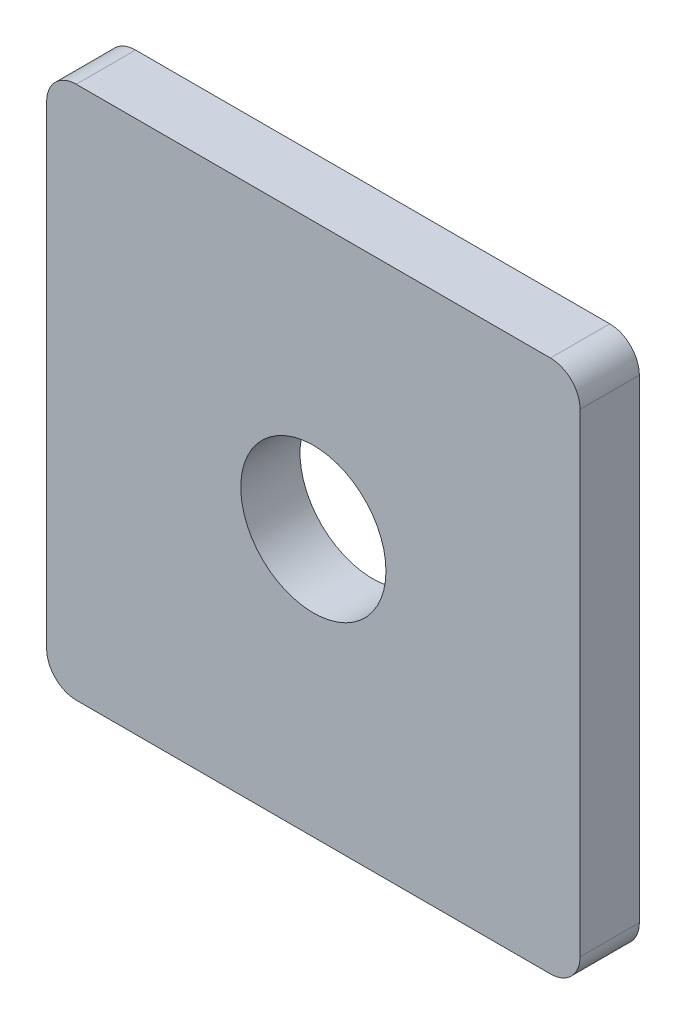
ISO-10303-21;
HEADER;
FILE_DESCRIPTION(('STEP AP214'),'2;1');
FILE_NAME('part.step','',(''),(''),'','','');
FILE_SCHEMA(('AUTOMOTIVE_DESIGN { 1 0 10303 214 1 1 1 1 }'));
ENDSEC;
DATA;
#1=APPLICATION_CONTEXT('core data for automotive mechanical design processes');
#2=APPLICATION_PROTOCOL_DEFINITION('international standard','automotive_design',2000,#1);
#3=PRODUCT_CONTEXT('',#1,'mechanical');
#4=PRODUCT('Part','Part','',(#3));
#5=PRODUCT_RELATED_PRODUCT_CATEGORY('part','',(#4));
#6=PRODUCT_DEFINITION_FORMATION('','',#4);
#7=PRODUCT_DEFINITION_CONTEXT('part definition',#1,'design');
#8=PRODUCT_DEFINITION('design','',#6,#7);
#9=PRODUCT_DEFINITION_SHAPE('','',#8);
#10=(LENGTH_UNIT() NAMED_UNIT(*) SI_UNIT(.MILLI.,.METRE.));
#11=(NAMED_UNIT(*) PLANE_ANGLE_UNIT() SI_UNIT($,.RADIAN.));
#12=(NAMED_UNIT(*) SI_UNIT($,.STERADIAN.) SOLID_ANGLE_UNIT());
#13=UNCERTAINTY_MEASURE_WITH_UNIT(LENGTH_MEASURE(1.E-05),#10,'distance_accuracy_value','');
#14=(GEOMETRIC_REPRESENTATION_CONTEXT(3) GLOBAL_UNCERTAINTY_ASSIGNED_CONTEXT((#13)) GLOBAL_UNIT_ASSIGNED_CONTEXT((#10,
#11,#12)) REPRESENTATION_CONTEXT('',''));
#15=CARTESIAN_POINT('',(0.,0.,0.));
#16=DIRECTION('',(0.,0.,1.));
#17=DIRECTION('',(1.,0.,0.));
#18=AXIS2_PLACEMENT_3D('',#15,#16,#17);
#19=CARTESIAN_POINT('',(0.,0.,2.));
#20=DIRECTION('',(0.,0.,1.));
#21=DIRECTION('',(1.,0.,0.));
#22=AXIS2_PLACEMENT_3D('',#19,#20,#21);
#23=PLANE('',#22);
#24=DIRECTION('',(0.,-1.,0.));
#25=VECTOR('',#24,1.);
#26=CARTESIAN_POINT('',(-9.,9.,2.));
#27=LINE('',#26,#25);
#28=CARTESIAN_POINT('',(-9.,8.,2.));
#29=VERTEX_POINT('',#28);
#30=CARTESIAN_POINT('',(-9.,-8.,2.));
#31=VERTEX_POINT('',#30);
#32=EDGE_CURVE('E171',#29,#31,#27,.T.);
#33=ORIENTED_EDGE('',*,*,#32,.T.);
#34=CARTESIAN_POINT('',(-8.,-8.,2.));
#35=DIRECTION('',(0.,0.,1.));
#36=DIRECTION('',(1.,0.,0.));
#37=AXIS2_PLACEMENT_3D('',#34,#35,#36);
#38=CIRCLE('',#37,1.);
#39=CARTESIAN_POINT('',(-8.,-9.,2.));
#40=VERTEX_POINT('',#39);
#41=EDGE_CURVE('E148',#31,#40,#38,.T.);
#42=ORIENTED_EDGE('',*,*,#41,.T.);
#43=DIRECTION('',(1.,0.,0.));
#44=VECTOR('',#43,1.);
#45=CARTESIAN_POINT('',(-9.,-9.,2.));
#46=LINE('',#45,#44);
#47=CARTESIAN_POINT('',(8.,-9.,2.));
#48=VERTEX_POINT('',#47);
#49=EDGE_CURVE('E119',#40,#48,#46,.T.);
#50=ORIENTED_EDGE('',*,*,#49,.T.);
#51=CARTESIAN_POINT('',(8.,-8.,2.));
#52=DIRECTION('',(0.,0.,1.));
#53=DIRECTION('',(1.,0.,0.));
#54=AXIS2_PLACEMENT_3D('',#51,#52,#53);
#55=CIRCLE('',#54,1.);
#56=CARTESIAN_POINT('',(9.,-8.,2.));
#57=VERTEX_POINT('',#56);
#58=EDGE_CURVE('E144',#48,#57,#55,.T.);
#59=ORIENTED_EDGE('',*,*,#58,.T.);
#60=DIRECTION('',(0.,1.,0.));
#61=VECTOR('',#60,1.);
#62=CARTESIAN_POINT('',(9.,9.,2.));
#63=LINE('',#62,#61);
#64=CARTESIAN_POINT('',(9.,8.,2.));
#65=VERTEX_POINT('',#64);
#66=EDGE_CURVE('E127',#57,#65,#63,.T.);
#67=ORIENTED_EDGE('',*,*,#66,.T.);
#68=CARTESIAN_POINT('',(8.,8.,2.));
#69=DIRECTION('',(0.,0.,1.));
#70=DIRECTION('',(1.,0.,0.));
#71=AXIS2_PLACEMENT_3D('',#68,#69,#70);
#72=CIRCLE('',#71,1.);
#73=CARTESIAN_POINT('',(8.,9.,2.));
#74=VERTEX_POINT('',#73);
#75=EDGE_CURVE('E54',#65,#74,#72,.T.);
#76=ORIENTED_EDGE('',*,*,#75,.T.);
#77=DIRECTION('',(-1.,0.,0.));
#78=VECTOR('',#77,1.);
#79=CARTESIAN_POINT('',(-9.,9.,2.));
#80=LINE('',#79,#78);
#81=CARTESIAN_POINT('',(-8.,9.,2.));
#82=VERTEX_POINT('',#81);
#83=EDGE_CURVE('E130',#74,#82,#80,.T.);
#84=ORIENTED_EDGE('',*,*,#83,.T.);
#85=CARTESIAN_POINT('',(-8.,8.,2.));
#86=DIRECTION('',(0.,0.,1.));
#87=DIRECTION('',(1.,0.,0.));
#88=AXIS2_PLACEMENT_3D('',#85,#86,#87);
#89=CIRCLE('',#88,1.);
#90=EDGE_CURVE('E146',#82,#29,#89,.T.);
#91=ORIENTED_EDGE('',*,*,#90,.T.);
#92=EDGE_LOOP('',(#33,#42,#50,#59,#67,#76,#84,#91));
#93=FACE_BOUND('',#92,.T.);
#94=CARTESIAN_POINT('',(0.,0.,2.));
#95=DIRECTION('',(0.,0.,1.));
#96=DIRECTION('',(1.,0.,0.));
#97=AXIS2_PLACEMENT_3D('',#94,#95,#96);
#98=CIRCLE('',#97,2.45);
#99=CARTESIAN_POINT('',(2.45,0.,2.));
#100=VERTEX_POINT('',#99);
#101=EDGE_CURVE('E167',#100,#100,#98,.T.);
#102=ORIENTED_EDGE('',*,*,#101,.F.);
#103=EDGE_LOOP('',(#102));
#104=FACE_BOUND('',#103,.T.);
#105=ADVANCED_FACE('F32',(#93,#104),#23,.T.);
#106=CARTESIAN_POINT('',(0.,0.,0.));
#107=DIRECTION('',(0.,0.,1.));
#108=DIRECTION('',(1.,0.,0.));
#109=AXIS2_PLACEMENT_3D('',#106,#107,#108);
#110=PLANE('',#109);
#111=DIRECTION('',(1.,0.,0.));
#112=VECTOR('',#111,1.);
#113=CARTESIAN_POINT('',(-9.,-9.,0.));
#114=LINE('',#113,#112);
#115=CARTESIAN_POINT('',(-8.,-9.,0.));
#116=VERTEX_POINT('',#115);
#117=CARTESIAN_POINT('',(8.,-9.,0.));
#118=VERTEX_POINT('',#117);
#119=EDGE_CURVE('E116',#116,#118,#114,.T.);
#120=ORIENTED_EDGE('',*,*,#119,.F.);
#121=CARTESIAN_POINT('',(-8.,-8.,0.));
#122=DIRECTION('',(0.,0.,1.));
#123=DIRECTION('',(1.,0.,0.));
#124=AXIS2_PLACEMENT_3D('',#121,#122,#123);
#125=CIRCLE('',#124,1.);
#126=CARTESIAN_POINT('',(-9.,-8.,0.));
#127=VERTEX_POINT('',#126);
#128=EDGE_CURVE('E99',#116,#127,#125,.F.);
#129=ORIENTED_EDGE('',*,*,#128,.T.);
#130=DIRECTION('',(0.,-1.,0.));
#131=VECTOR('',#130,1.);
#132=CARTESIAN_POINT('',(-9.,9.,0.));
#133=LINE('',#132,#131);
#134=CARTESIAN_POINT('',(-9.,8.,0.));
#135=VERTEX_POINT('',#134);
#136=EDGE_CURVE('E128',#135,#127,#133,.T.);
#137=ORIENTED_EDGE('',*,*,#136,.F.);
#138=CARTESIAN_POINT('',(-8.,8.,0.));
#139=DIRECTION('',(0.,0.,1.));
#140=DIRECTION('',(1.,0.,0.));
#141=AXIS2_PLACEMENT_3D('',#138,#139,#140);
#142=CIRCLE('',#141,1.);
#143=CARTESIAN_POINT('',(-8.,9.,0.));
#144=VERTEX_POINT('',#143);
#145=EDGE_CURVE('E110',#135,#144,#142,.F.);
#146=ORIENTED_EDGE('',*,*,#145,.T.);
#147=DIRECTION('',(-1.,0.,0.));
#148=VECTOR('',#147,1.);
#149=CARTESIAN_POINT('',(-9.,9.,0.));
#150=LINE('',#149,#148);
#151=CARTESIAN_POINT('',(8.,9.,0.));
#152=VERTEX_POINT('',#151);
#153=EDGE_CURVE('E132',#152,#144,#150,.T.);
#154=ORIENTED_EDGE('',*,*,#153,.F.);
#155=CARTESIAN_POINT('',(8.,8.,0.));
#156=DIRECTION('',(0.,0.,1.));
#157=DIRECTION('',(1.,0.,0.));
#158=AXIS2_PLACEMENT_3D('',#155,#156,#157);
#159=CIRCLE('',#158,1.);
#160=CARTESIAN_POINT('',(9.,8.,0.));
#161=VERTEX_POINT('',#160);
#162=EDGE_CURVE('E120',#152,#161,#159,.F.);
#163=ORIENTED_EDGE('',*,*,#162,.T.);
#164=DIRECTION('',(0.,1.,0.));
#165=VECTOR('',#164,1.);
#166=CARTESIAN_POINT('',(9.,9.,0.));
#167=LINE('',#166,#165);
#168=CARTESIAN_POINT('',(9.,-8.,0.));
#169=VERTEX_POINT('',#168);
#170=EDGE_CURVE('E159',#169,#161,#167,.T.);
#171=ORIENTED_EDGE('',*,*,#170,.F.);
#172=CARTESIAN_POINT('',(8.,-8.,0.));
#173=DIRECTION('',(0.,0.,1.));
#174=DIRECTION('',(1.,0.,0.));
#175=AXIS2_PLACEMENT_3D('',#172,#173,#174);
#176=CIRCLE('',#175,1.);
#177=EDGE_CURVE('E126',#169,#118,#176,.F.);
#178=ORIENTED_EDGE('',*,*,#177,.T.);
#179=EDGE_LOOP('',(#120,#129,#137,#146,#154,#163,#171,#178));
#180=FACE_BOUND('',#179,.T.);
#181=CARTESIAN_POINT('',(0.,0.,0.));
#182=DIRECTION('',(0.,0.,1.));
#183=DIRECTION('',(1.,0.,0.));
#184=AXIS2_PLACEMENT_3D('',#181,#182,#183);
#185=CIRCLE('',#184,2.45);
#186=CARTESIAN_POINT('',(2.45,0.,0.));
#187=VERTEX_POINT('',#186);
#188=EDGE_CURVE('E174',#187,#187,#185,.T.);
#189=ORIENTED_EDGE('',*,*,#188,.T.);
#190=EDGE_LOOP('',(#189));
#191=FACE_BOUND('',#190,.T.);
#192=ADVANCED_FACE('F123',(#180,#191),#110,.F.);
#193=CARTESIAN_POINT('',(9.,9.,2.));
#194=DIRECTION('',(-1.,0.,0.));
#195=DIRECTION('',(0.,-1.,0.));
#196=AXIS2_PLACEMENT_3D('',#193,#194,#195);
#197=PLANE('',#196);
#198=ORIENTED_EDGE('',*,*,#66,.F.);
#199=DIRECTION('',(0.,0.,-1.));
#200=VECTOR('',#199,1.);
#201=CARTESIAN_POINT('',(9.,-8.,2.));
#202=LINE('',#201,#200);
#203=EDGE_CURVE('E11',#57,#169,#202,.T.);
#204=ORIENTED_EDGE('',*,*,#203,.T.);
#205=ORIENTED_EDGE('',*,*,#170,.T.);
#206=DIRECTION('',(0.,0.,-1.));
#207=VECTOR('',#206,1.);
#208=CARTESIAN_POINT('',(9.,8.,2.));
#209=LINE('',#208,#207);
#210=EDGE_CURVE('E40',#161,#65,#209,.F.);
#211=ORIENTED_EDGE('',*,*,#210,.T.);
#212=EDGE_LOOP('',(#198,#204,#205,#211));
#213=FACE_BOUND('',#212,.T.);
#214=ADVANCED_FACE('F157',(#213),#197,.F.);
#215=CARTESIAN_POINT('',(-9.,9.,2.));
#216=DIRECTION('',(0.,-1.,0.));
#217=DIRECTION('',(0.,0.,-1.));
#218=AXIS2_PLACEMENT_3D('',#215,#216,#217);
#219=PLANE('',#218);
#220=ORIENTED_EDGE('',*,*,#153,.T.);
#221=DIRECTION('',(0.,0.,-1.));
#222=VECTOR('',#221,1.);
#223=CARTESIAN_POINT('',(-8.,9.,2.));
#224=LINE('',#223,#222);
#225=EDGE_CURVE('E47',#144,#82,#224,.F.);
#226=ORIENTED_EDGE('',*,*,#225,.T.);
#227=ORIENTED_EDGE('',*,*,#83,.F.);
#228=DIRECTION('',(0.,0.,-1.));
#229=VECTOR('',#228,1.);
#230=CARTESIAN_POINT('',(8.,9.,2.));
#231=LINE('',#230,#229);
#232=EDGE_CURVE('E150',#74,#152,#231,.T.);
#233=ORIENTED_EDGE('',*,*,#232,.T.);
#234=EDGE_LOOP('',(#220,#226,#227,#233));
#235=FACE_BOUND('',#234,.T.);
#236=ADVANCED_FACE('F166',(#235),#219,.F.);
#237=CARTESIAN_POINT('',(-9.,9.,2.));
#238=DIRECTION('',(1.,0.,0.));
#239=DIRECTION('',(0.,1.,0.));
#240=AXIS2_PLACEMENT_3D('',#237,#238,#239);
#241=PLANE('',#240);
#242=ORIENTED_EDGE('',*,*,#136,.T.);
#243=DIRECTION('',(0.,0.,-1.));
#244=VECTOR('',#243,1.);
#245=CARTESIAN_POINT('',(-9.,-8.,2.));
#246=LINE('',#245,#244);
#247=EDGE_CURVE('E104',#127,#31,#246,.F.);
#248=ORIENTED_EDGE('',*,*,#247,.T.);
#249=ORIENTED_EDGE('',*,*,#32,.F.);
#250=DIRECTION('',(0.,0.,-1.));
#251=VECTOR('',#250,1.);
#252=CARTESIAN_POINT('',(-9.,8.,2.));
#253=LINE('',#252,#251);
#254=EDGE_CURVE('E109',#29,#135,#253,.T.);
#255=ORIENTED_EDGE('',*,*,#254,.T.);
#256=EDGE_LOOP('',(#242,#248,#249,#255));
#257=FACE_BOUND('',#256,.T.);
#258=ADVANCED_FACE('F192',(#257),#241,.F.);
#259=CARTESIAN_POINT('',(-9.,-9.,2.));
#260=DIRECTION('',(0.,1.,0.));
#261=DIRECTION('',(0.,0.,1.));
#262=AXIS2_PLACEMENT_3D('',#259,#260,#261);
#263=PLANE('',#262);
#264=ORIENTED_EDGE('',*,*,#49,.F.);
#265=DIRECTION('',(0.,0.,-1.));
#266=VECTOR('',#265,1.);
#267=CARTESIAN_POINT('',(-8.,-9.,2.));
#268=LINE('',#267,#266);
#269=EDGE_CURVE('E103',#40,#116,#268,.T.);
#270=ORIENTED_EDGE('',*,*,#269,.T.);
#271=ORIENTED_EDGE('',*,*,#119,.T.);
#272=DIRECTION('',(0.,0.,-1.));
#273=VECTOR('',#272,1.);
#274=CARTESIAN_POINT('',(8.,-9.,2.));
#275=LINE('',#274,#273);
#276=EDGE_CURVE('E121',#118,#48,#275,.F.);
#277=ORIENTED_EDGE('',*,*,#276,.T.);
#278=EDGE_LOOP('',(#264,#270,#271,#277));
#279=FACE_BOUND('',#278,.T.);
#280=ADVANCED_FACE('F115',(#279),#263,.F.);
#281=CARTESIAN_POINT('',(0.,0.,2.));
#282=DIRECTION('',(0.,0.,-1.));
#283=DIRECTION('',(-1.,0.,0.));
#284=AXIS2_PLACEMENT_3D('',#281,#282,#283);
#285=CYLINDRICAL_SURFACE('',#284,2.45);
#286=ORIENTED_EDGE('',*,*,#101,.T.);
#287=EDGE_LOOP('',(#286));
#288=FACE_BOUND('',#287,.T.);
#289=ORIENTED_EDGE('',*,*,#188,.F.);
#290=EDGE_LOOP('',(#289));
#291=FACE_BOUND('',#290,.T.);
#292=ADVANCED_FACE('F180',(#288,#291),#285,.F.);
#293=CARTESIAN_POINT('',(-8.,-8.,2.));
#294=DIRECTION('',(0.,0.,-1.));
#295=DIRECTION('',(-1.,0.,0.));
#296=AXIS2_PLACEMENT_3D('',#293,#294,#295);
#297=CYLINDRICAL_SURFACE('',#296,1.);
#298=ORIENTED_EDGE('',*,*,#41,.F.);
#299=ORIENTED_EDGE('',*,*,#247,.F.);
#300=ORIENTED_EDGE('',*,*,#128,.F.);
#301=ORIENTED_EDGE('',*,*,#269,.F.);
#302=EDGE_LOOP('',(#298,#299,#300,#301));
#303=FACE_BOUND('',#302,.T.);
#304=ADVANCED_FACE('F102',(#303),#297,.T.);
#305=CARTESIAN_POINT('',(-8.,8.,2.));
#306=DIRECTION('',(0.,0.,-1.));
#307=DIRECTION('',(-1.,0.,0.));
#308=AXIS2_PLACEMENT_3D('',#305,#306,#307);
#309=CYLINDRICAL_SURFACE('',#308,1.);
#310=ORIENTED_EDGE('',*,*,#90,.F.);
#311=ORIENTED_EDGE('',*,*,#225,.F.);
#312=ORIENTED_EDGE('',*,*,#145,.F.);
#313=ORIENTED_EDGE('',*,*,#254,.F.);
#314=EDGE_LOOP('',(#310,#311,#312,#313));
#315=FACE_BOUND('',#314,.T.);
#316=ADVANCED_FACE('F202',(#315),#309,.T.);
#317=CARTESIAN_POINT('',(8.,-8.,2.));
#318=DIRECTION('',(0.,0.,-1.));
#319=DIRECTION('',(-1.,0.,0.));
#320=AXIS2_PLACEMENT_3D('',#317,#318,#319);
#321=CYLINDRICAL_SURFACE('',#320,1.);
#322=ORIENTED_EDGE('',*,*,#58,.F.);
#323=ORIENTED_EDGE('',*,*,#276,.F.);
#324=ORIENTED_EDGE('',*,*,#177,.F.);
#325=ORIENTED_EDGE('',*,*,#203,.F.);
#326=EDGE_LOOP('',(#322,#323,#324,#325));
#327=FACE_BOUND('',#326,.T.);
#328=ADVANCED_FACE('F204',(#327),#321,.T.);
#329=CARTESIAN_POINT('',(8.,8.,2.));
#330=DIRECTION('',(0.,0.,-1.));
#331=DIRECTION('',(-1.,0.,0.));
#332=AXIS2_PLACEMENT_3D('',#329,#330,#331);
#333=CYLINDRICAL_SURFACE('',#332,1.);
#334=ORIENTED_EDGE('',*,*,#75,.F.);
#335=ORIENTED_EDGE('',*,*,#210,.F.);
#336=ORIENTED_EDGE('',*,*,#162,.F.);
#337=ORIENTED_EDGE('',*,*,#232,.F.);
#338=EDGE_LOOP('',(#334,#335,#336,#337));
#339=FACE_BOUND('',#338,.T.);
#340=ADVANCED_FACE('F34',(#339),#333,.T.);
#341=CLOSED_SHELL('',(#105,#192,#214,#236,#258,#280,#292,#304,#316,#328,#340));
#342=MANIFOLD_SOLID_BREP('B2',#341);
#343=ADVANCED_BREP_SHAPE_REPRESENTATION('',(#18,#342),#14);
#344=SHAPE_DEFINITION_REPRESENTATION(#9,#343);
ENDSEC;
END-ISO-10303-21;
